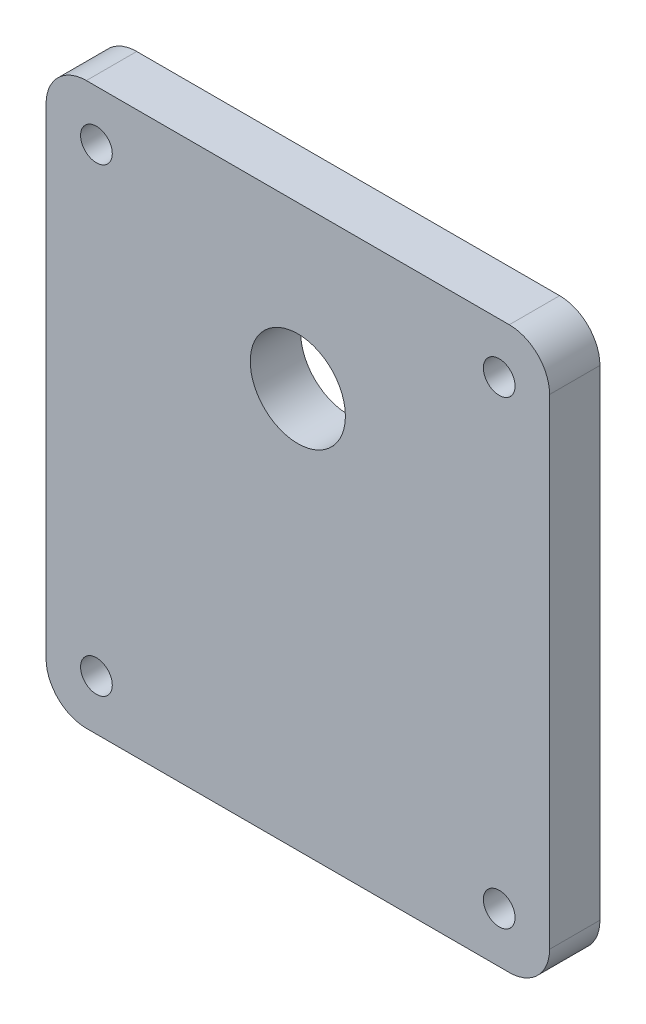
ISO-10303-21;
HEADER;
FILE_DESCRIPTION(('STEP AP214'),'2;1');
FILE_NAME('part.step','',(''),(''),'','','');
FILE_SCHEMA(('AUTOMOTIVE_DESIGN { 1 0 10303 214 1 1 1 1 }'));
ENDSEC;
DATA;
#1=APPLICATION_CONTEXT('core data for automotive mechanical design processes');
#2=APPLICATION_PROTOCOL_DEFINITION('international standard','automotive_design',2000,#1);
#3=PRODUCT_CONTEXT('',#1,'mechanical');
#4=PRODUCT('Part','Part','',(#3));
#5=PRODUCT_RELATED_PRODUCT_CATEGORY('part','',(#4));
#6=PRODUCT_DEFINITION_FORMATION('','',#4);
#7=PRODUCT_DEFINITION_CONTEXT('part definition',#1,'design');
#8=PRODUCT_DEFINITION('design','',#6,#7);
#9=PRODUCT_DEFINITION_SHAPE('','',#8);
#10=(LENGTH_UNIT() NAMED_UNIT(*) SI_UNIT(.MILLI.,.METRE.));
#11=(NAMED_UNIT(*) PLANE_ANGLE_UNIT() SI_UNIT($,.RADIAN.));
#12=(NAMED_UNIT(*) SI_UNIT($,.STERADIAN.) SOLID_ANGLE_UNIT());
#13=UNCERTAINTY_MEASURE_WITH_UNIT(LENGTH_MEASURE(1.E-05),#10,'distance_accuracy_value','');
#14=(GEOMETRIC_REPRESENTATION_CONTEXT(3) GLOBAL_UNCERTAINTY_ASSIGNED_CONTEXT((#13)) GLOBAL_UNIT_ASSIGNED_CONTEXT((#10,
#11,#12)) REPRESENTATION_CONTEXT('',''));
#15=CARTESIAN_POINT('',(0.,0.,0.));
#16=DIRECTION('',(0.,0.,1.));
#17=DIRECTION('',(1.,0.,0.));
#18=AXIS2_PLACEMENT_3D('',#15,#16,#17);
#19=CARTESIAN_POINT('',(-18.1,-22.0973062704397,-6.35));
#20=DIRECTION('',(0.,0.,-1.));
#21=DIRECTION('',(-1.,0.,0.));
#22=AXIS2_PLACEMENT_3D('',#19,#20,#21);
#23=PLANE('',#22);
#24=CARTESIAN_POINT('',(0.,17.8847845003735,-6.35));
#25=DIRECTION('',(0.,0.,1.));
#26=DIRECTION('',(1.,0.,0.));
#27=AXIS2_PLACEMENT_3D('',#24,#25,#26);
#28=CIRCLE('',#27,6.);
#29=CARTESIAN_POINT('',(6.,17.8847845003735,-6.35));
#30=VERTEX_POINT('',#29);
#31=EDGE_CURVE('E181',#30,#30,#28,.T.);
#32=ORIENTED_EDGE('',*,*,#31,.T.);
#33=EDGE_LOOP('',(#32));
#34=FACE_BOUND('',#33,.T.);
#35=CARTESIAN_POINT('',(-25.4,31.8547845003731,-6.35));
#36=DIRECTION('',(0.,0.,1.));
#37=DIRECTION('',(1.,0.,0.));
#38=AXIS2_PLACEMENT_3D('',#35,#36,#37);
#39=CIRCLE('',#38,2.00000000000001);
#40=CARTESIAN_POINT('',(-23.4,31.8547845003731,-6.35));
#41=VERTEX_POINT('',#40);
#42=EDGE_CURVE('E174',#41,#41,#39,.T.);
#43=ORIENTED_EDGE('',*,*,#42,.T.);
#44=EDGE_LOOP('',(#43));
#45=FACE_BOUND('',#44,.T.);
#46=CARTESIAN_POINT('',(-25.3999999999994,-26.1968739249436,-6.35));
#47=DIRECTION('',(0.,0.,1.));
#48=DIRECTION('',(1.,0.,0.));
#49=AXIS2_PLACEMENT_3D('',#46,#47,#48);
#50=CIRCLE('',#49,2.00000000000001);
#51=CARTESIAN_POINT('',(-23.3999999999994,-26.1968739249436,-6.35));
#52=VERTEX_POINT('',#51);
#53=EDGE_CURVE('E187',#52,#52,#50,.T.);
#54=ORIENTED_EDGE('',*,*,#53,.T.);
#55=EDGE_LOOP('',(#54));
#56=FACE_BOUND('',#55,.T.);
#57=CARTESIAN_POINT('',(25.4000000000006,-26.1968739249436,-6.35));
#58=DIRECTION('',(0.,0.,1.));
#59=DIRECTION('',(1.,0.,0.));
#60=AXIS2_PLACEMENT_3D('',#57,#58,#59);
#61=CIRCLE('',#60,2.00000000000001);
#62=CARTESIAN_POINT('',(27.4000000000006,-26.1968739249436,-6.35));
#63=VERTEX_POINT('',#62);
#64=EDGE_CURVE('E180',#63,#63,#61,.T.);
#65=ORIENTED_EDGE('',*,*,#64,.T.);
#66=EDGE_LOOP('',(#65));
#67=FACE_BOUND('',#66,.T.);
#68=CARTESIAN_POINT('',(25.4,31.8547845003735,-6.35));
#69=DIRECTION('',(0.,0.,1.));
#70=DIRECTION('',(1.,0.,0.));
#71=AXIS2_PLACEMENT_3D('',#68,#69,#70);
#72=CIRCLE('',#71,2.00000000000001);
#73=CARTESIAN_POINT('',(27.4,31.8547845003735,-6.35));
#74=VERTEX_POINT('',#73);
#75=EDGE_CURVE('E170',#74,#74,#72,.T.);
#76=ORIENTED_EDGE('',*,*,#75,.T.);
#77=EDGE_LOOP('',(#76));
#78=FACE_BOUND('',#77,.T.);
#79=DIRECTION('',(1.,0.,0.));
#80=VECTOR('',#79,1.);
#81=CARTESIAN_POINT('',(-18.1,-32.5468739249436,-6.35));
#82=LINE('',#81,#80);
#83=CARTESIAN_POINT('',(-26.67,-32.5468739249436,-6.35));
#84=VERTEX_POINT('',#83);
#85=CARTESIAN_POINT('',(26.67,-32.5468739249436,-6.35));
#86=VERTEX_POINT('',#85);
#87=EDGE_CURVE('E163',#84,#86,#82,.T.);
#88=ORIENTED_EDGE('',*,*,#87,.F.);
#89=CARTESIAN_POINT('',(-26.67,-27.4668739249436,-6.35));
#90=DIRECTION('',(0.,0.,-1.));
#91=DIRECTION('',(-1.,0.,0.));
#92=AXIS2_PLACEMENT_3D('',#89,#90,#91);
#93=CIRCLE('',#92,5.08);
#94=CARTESIAN_POINT('',(-31.75,-27.4668739249436,-6.35));
#95=VERTEX_POINT('',#94);
#96=EDGE_CURVE('E11',#84,#95,#93,.T.);
#97=ORIENTED_EDGE('',*,*,#96,.T.);
#98=DIRECTION('',(0.,1.,0.));
#99=VECTOR('',#98,1.);
#100=CARTESIAN_POINT('',(-31.75,38.2047845003735,-6.35));
#101=LINE('',#100,#99);
#102=CARTESIAN_POINT('',(-31.75,33.1247845003735,-6.35));
#103=VERTEX_POINT('',#102);
#104=EDGE_CURVE('E162',#95,#103,#101,.T.);
#105=ORIENTED_EDGE('',*,*,#104,.T.);
#106=CARTESIAN_POINT('',(-26.67,33.1247845003735,-6.35));
#107=DIRECTION('',(0.,0.,-1.));
#108=DIRECTION('',(-1.,0.,0.));
#109=AXIS2_PLACEMENT_3D('',#106,#107,#108);
#110=CIRCLE('',#109,5.08);
#111=CARTESIAN_POINT('',(-26.67,38.2047845003735,-6.35));
#112=VERTEX_POINT('',#111);
#113=EDGE_CURVE('E122',#103,#112,#110,.T.);
#114=ORIENTED_EDGE('',*,*,#113,.T.);
#115=DIRECTION('',(1.,0.,0.));
#116=VECTOR('',#115,1.);
#117=CARTESIAN_POINT('',(31.75,38.2047845003735,-6.35));
#118=LINE('',#117,#116);
#119=CARTESIAN_POINT('',(26.67,38.2047845003735,-6.35));
#120=VERTEX_POINT('',#119);
#121=EDGE_CURVE('E156',#112,#120,#118,.T.);
#122=ORIENTED_EDGE('',*,*,#121,.T.);
#123=CARTESIAN_POINT('',(26.67,33.1247845003735,-6.35));
#124=DIRECTION('',(0.,0.,-1.));
#125=DIRECTION('',(-1.,0.,0.));
#126=AXIS2_PLACEMENT_3D('',#123,#124,#125);
#127=CIRCLE('',#126,5.08);
#128=CARTESIAN_POINT('',(31.75,33.1247845003735,-6.35));
#129=VERTEX_POINT('',#128);
#130=EDGE_CURVE('E142',#120,#129,#127,.T.);
#131=ORIENTED_EDGE('',*,*,#130,.T.);
#132=DIRECTION('',(0.,-1.,0.));
#133=VECTOR('',#132,1.);
#134=CARTESIAN_POINT('',(31.75,38.2047845003735,-6.35));
#135=LINE('',#134,#133);
#136=CARTESIAN_POINT('',(31.75,-27.4668739249436,-6.35));
#137=VERTEX_POINT('',#136);
#138=EDGE_CURVE('E108',#129,#137,#135,.T.);
#139=ORIENTED_EDGE('',*,*,#138,.T.);
#140=CARTESIAN_POINT('',(26.67,-27.4668739249436,-6.35));
#141=DIRECTION('',(0.,0.,-1.));
#142=DIRECTION('',(-1.,0.,0.));
#143=AXIS2_PLACEMENT_3D('',#140,#141,#142);
#144=CIRCLE('',#143,5.08);
#145=EDGE_CURVE('E144',#137,#86,#144,.T.);
#146=ORIENTED_EDGE('',*,*,#145,.T.);
#147=EDGE_LOOP('',(#88,#97,#105,#114,#122,#131,#139,#146));
#148=FACE_BOUND('',#147,.T.);
#149=ADVANCED_FACE('F35',(#34,#45,#56,#67,#78,#148),#23,.T.);
#150=CARTESIAN_POINT('',(-18.1,-22.0973062704397,0.));
#151=DIRECTION('',(0.,0.,-1.));
#152=DIRECTION('',(-1.,0.,0.));
#153=AXIS2_PLACEMENT_3D('',#150,#151,#152);
#154=PLANE('',#153);
#155=CARTESIAN_POINT('',(0.,17.8847845003735,0.));
#156=DIRECTION('',(0.,0.,1.));
#157=DIRECTION('',(1.,0.,0.));
#158=AXIS2_PLACEMENT_3D('',#155,#156,#157);
#159=CIRCLE('',#158,6.);
#160=CARTESIAN_POINT('',(6.,17.8847845003735,0.));
#161=VERTEX_POINT('',#160);
#162=EDGE_CURVE('E195',#161,#161,#159,.T.);
#163=ORIENTED_EDGE('',*,*,#162,.F.);
#164=EDGE_LOOP('',(#163));
#165=FACE_BOUND('',#164,.T.);
#166=CARTESIAN_POINT('',(-25.4,31.8547845003731,0.));
#167=DIRECTION('',(0.,0.,1.));
#168=DIRECTION('',(1.,0.,0.));
#169=AXIS2_PLACEMENT_3D('',#166,#167,#168);
#170=CIRCLE('',#169,2.00000000000001);
#171=CARTESIAN_POINT('',(-23.4,31.8547845003731,0.));
#172=VERTEX_POINT('',#171);
#173=EDGE_CURVE('E190',#172,#172,#170,.T.);
#174=ORIENTED_EDGE('',*,*,#173,.F.);
#175=EDGE_LOOP('',(#174));
#176=FACE_BOUND('',#175,.T.);
#177=CARTESIAN_POINT('',(-25.3999999999994,-26.1968739249436,0.));
#178=DIRECTION('',(0.,0.,1.));
#179=DIRECTION('',(1.,0.,0.));
#180=AXIS2_PLACEMENT_3D('',#177,#178,#179);
#181=CIRCLE('',#180,2.00000000000001);
#182=CARTESIAN_POINT('',(-23.3999999999994,-26.1968739249436,0.));
#183=VERTEX_POINT('',#182);
#184=EDGE_CURVE('E184',#183,#183,#181,.T.);
#185=ORIENTED_EDGE('',*,*,#184,.F.);
#186=EDGE_LOOP('',(#185));
#187=FACE_BOUND('',#186,.T.);
#188=CARTESIAN_POINT('',(25.4000000000006,-26.1968739249436,0.));
#189=DIRECTION('',(0.,0.,1.));
#190=DIRECTION('',(1.,0.,0.));
#191=AXIS2_PLACEMENT_3D('',#188,#189,#190);
#192=CIRCLE('',#191,2.00000000000001);
#193=CARTESIAN_POINT('',(27.4000000000006,-26.1968739249436,0.));
#194=VERTEX_POINT('',#193);
#195=EDGE_CURVE('E177',#194,#194,#192,.T.);
#196=ORIENTED_EDGE('',*,*,#195,.F.);
#197=EDGE_LOOP('',(#196));
#198=FACE_BOUND('',#197,.T.);
#199=CARTESIAN_POINT('',(25.4,31.8547845003735,0.));
#200=DIRECTION('',(0.,0.,1.));
#201=DIRECTION('',(1.,0.,0.));
#202=AXIS2_PLACEMENT_3D('',#199,#200,#201);
#203=CIRCLE('',#202,2.00000000000001);
#204=CARTESIAN_POINT('',(27.4,31.8547845003735,0.));
#205=VERTEX_POINT('',#204);
#206=EDGE_CURVE('E171',#205,#205,#203,.T.);
#207=ORIENTED_EDGE('',*,*,#206,.F.);
#208=EDGE_LOOP('',(#207));
#209=FACE_BOUND('',#208,.T.);
#210=DIRECTION('',(0.,1.,0.));
#211=VECTOR('',#210,1.);
#212=CARTESIAN_POINT('',(-31.75,38.2047845003735,0.));
#213=LINE('',#212,#211);
#214=CARTESIAN_POINT('',(-31.75,-27.4668739249436,0.));
#215=VERTEX_POINT('',#214);
#216=CARTESIAN_POINT('',(-31.75,33.1247845003735,0.));
#217=VERTEX_POINT('',#216);
#218=EDGE_CURVE('E99',#215,#217,#213,.T.);
#219=ORIENTED_EDGE('',*,*,#218,.F.);
#220=CARTESIAN_POINT('',(-26.67,-27.4668739249436,0.));
#221=DIRECTION('',(0.,0.,-1.));
#222=DIRECTION('',(-1.,0.,0.));
#223=AXIS2_PLACEMENT_3D('',#220,#221,#222);
#224=CIRCLE('',#223,5.08);
#225=CARTESIAN_POINT('',(-26.67,-32.5468739249436,0.));
#226=VERTEX_POINT('',#225);
#227=EDGE_CURVE('E57',#215,#226,#224,.F.);
#228=ORIENTED_EDGE('',*,*,#227,.T.);
#229=DIRECTION('',(-1.,0.,0.));
#230=VECTOR('',#229,1.);
#231=CARTESIAN_POINT('',(-31.75,-32.5468739249436,0.));
#232=LINE('',#231,#230);
#233=CARTESIAN_POINT('',(26.67,-32.5468739249436,0.));
#234=VERTEX_POINT('',#233);
#235=EDGE_CURVE('E168',#234,#226,#232,.T.);
#236=ORIENTED_EDGE('',*,*,#235,.F.);
#237=CARTESIAN_POINT('',(26.67,-27.4668739249436,0.));
#238=DIRECTION('',(0.,0.,-1.));
#239=DIRECTION('',(-1.,0.,0.));
#240=AXIS2_PLACEMENT_3D('',#237,#238,#239);
#241=CIRCLE('',#240,5.08);
#242=CARTESIAN_POINT('',(31.75,-27.4668739249436,0.));
#243=VERTEX_POINT('',#242);
#244=EDGE_CURVE('E136',#234,#243,#241,.F.);
#245=ORIENTED_EDGE('',*,*,#244,.T.);
#246=DIRECTION('',(0.,-1.,0.));
#247=VECTOR('',#246,1.);
#248=CARTESIAN_POINT('',(31.75,38.2047845003735,0.));
#249=LINE('',#248,#247);
#250=CARTESIAN_POINT('',(31.75,33.1247845003735,0.));
#251=VERTEX_POINT('',#250);
#252=EDGE_CURVE('E123',#251,#243,#249,.T.);
#253=ORIENTED_EDGE('',*,*,#252,.F.);
#254=CARTESIAN_POINT('',(26.67,33.1247845003735,0.));
#255=DIRECTION('',(0.,0.,-1.));
#256=DIRECTION('',(-1.,0.,0.));
#257=AXIS2_PLACEMENT_3D('',#254,#255,#256);
#258=CIRCLE('',#257,5.08);
#259=CARTESIAN_POINT('',(26.67,38.2047845003735,0.));
#260=VERTEX_POINT('',#259);
#261=EDGE_CURVE('E134',#251,#260,#258,.F.);
#262=ORIENTED_EDGE('',*,*,#261,.T.);
#263=DIRECTION('',(1.,0.,0.));
#264=VECTOR('',#263,1.);
#265=CARTESIAN_POINT('',(31.75,38.2047845003735,0.));
#266=LINE('',#265,#264);
#267=CARTESIAN_POINT('',(-26.67,38.2047845003735,0.));
#268=VERTEX_POINT('',#267);
#269=EDGE_CURVE('E107',#268,#260,#266,.T.);
#270=ORIENTED_EDGE('',*,*,#269,.F.);
#271=CARTESIAN_POINT('',(-26.67,33.1247845003735,0.));
#272=DIRECTION('',(0.,0.,-1.));
#273=DIRECTION('',(-1.,0.,0.));
#274=AXIS2_PLACEMENT_3D('',#271,#272,#273);
#275=CIRCLE('',#274,5.08);
#276=EDGE_CURVE('E112',#268,#217,#275,.F.);
#277=ORIENTED_EDGE('',*,*,#276,.T.);
#278=EDGE_LOOP('',(#219,#228,#236,#245,#253,#262,#270,#277));
#279=FACE_BOUND('',#278,.T.);
#280=ADVANCED_FACE('F113',(#165,#176,#187,#198,#209,#279),#154,.F.);
#281=CARTESIAN_POINT('',(-31.75,38.2047845003735,0.));
#282=DIRECTION('',(-1.,0.,0.));
#283=DIRECTION('',(0.,-1.,0.));
#284=AXIS2_PLACEMENT_3D('',#281,#282,#283);
#285=PLANE('',#284);
#286=ORIENTED_EDGE('',*,*,#104,.F.);
#287=DIRECTION('',(0.,0.,1.));
#288=VECTOR('',#287,1.);
#289=CARTESIAN_POINT('',(-31.75,-27.4668739249436,0.));
#290=LINE('',#289,#288);
#291=EDGE_CURVE('E106',#95,#215,#290,.T.);
#292=ORIENTED_EDGE('',*,*,#291,.T.);
#293=ORIENTED_EDGE('',*,*,#218,.T.);
#294=DIRECTION('',(0.,0.,-1.));
#295=VECTOR('',#294,1.);
#296=CARTESIAN_POINT('',(-31.75,33.1247845003735,0.));
#297=LINE('',#296,#295);
#298=EDGE_CURVE('E104',#217,#103,#297,.T.);
#299=ORIENTED_EDGE('',*,*,#298,.T.);
#300=EDGE_LOOP('',(#286,#292,#293,#299));
#301=FACE_BOUND('',#300,.T.);
#302=ADVANCED_FACE('F102',(#301),#285,.T.);
#303=CARTESIAN_POINT('',(31.75,38.2047845003735,0.));
#304=DIRECTION('',(1.,0.,0.));
#305=DIRECTION('',(0.,1.,0.));
#306=AXIS2_PLACEMENT_3D('',#303,#304,#305);
#307=PLANE('',#306);
#308=ORIENTED_EDGE('',*,*,#252,.T.);
#309=DIRECTION('',(0.,0.,1.));
#310=VECTOR('',#309,1.);
#311=CARTESIAN_POINT('',(31.75,-27.4668739249436,-6.35));
#312=LINE('',#311,#310);
#313=EDGE_CURVE('E140',#243,#137,#312,.F.);
#314=ORIENTED_EDGE('',*,*,#313,.T.);
#315=ORIENTED_EDGE('',*,*,#138,.F.);
#316=DIRECTION('',(0.,0.,-1.));
#317=VECTOR('',#316,1.);
#318=CARTESIAN_POINT('',(31.75,33.1247845003735,0.));
#319=LINE('',#318,#317);
#320=EDGE_CURVE('E138',#129,#251,#319,.F.);
#321=ORIENTED_EDGE('',*,*,#320,.T.);
#322=EDGE_LOOP('',(#308,#314,#315,#321));
#323=FACE_BOUND('',#322,.T.);
#324=ADVANCED_FACE('F258',(#323),#307,.T.);
#325=CARTESIAN_POINT('',(31.75,38.2047845003735,0.));
#326=DIRECTION('',(0.,1.,0.));
#327=DIRECTION('',(0.,0.,1.));
#328=AXIS2_PLACEMENT_3D('',#325,#326,#327);
#329=PLANE('',#328);
#330=ORIENTED_EDGE('',*,*,#269,.T.);
#331=DIRECTION('',(0.,0.,-1.));
#332=VECTOR('',#331,1.);
#333=CARTESIAN_POINT('',(26.67,38.2047845003735,0.));
#334=LINE('',#333,#332);
#335=EDGE_CURVE('E147',#260,#120,#334,.T.);
#336=ORIENTED_EDGE('',*,*,#335,.T.);
#337=ORIENTED_EDGE('',*,*,#121,.F.);
#338=DIRECTION('',(0.,0.,-1.));
#339=VECTOR('',#338,1.);
#340=CARTESIAN_POINT('',(-26.67,38.2047845003735,0.));
#341=LINE('',#340,#339);
#342=EDGE_CURVE('E118',#112,#268,#341,.F.);
#343=ORIENTED_EDGE('',*,*,#342,.T.);
#344=EDGE_LOOP('',(#330,#336,#337,#343));
#345=FACE_BOUND('',#344,.T.);
#346=ADVANCED_FACE('F155',(#345),#329,.T.);
#347=CARTESIAN_POINT('',(-31.75,-32.5468739249436,-10.));
#348=DIRECTION('',(0.,1.,0.));
#349=DIRECTION('',(0.,0.,1.));
#350=AXIS2_PLACEMENT_3D('',#347,#348,#349);
#351=PLANE('',#350);
#352=ORIENTED_EDGE('',*,*,#235,.T.);
#353=DIRECTION('',(0.,0.,1.));
#354=VECTOR('',#353,1.);
#355=CARTESIAN_POINT('',(-26.67,-32.5468739249436,-6.35));
#356=LINE('',#355,#354);
#357=EDGE_CURVE('E43',#226,#84,#356,.F.);
#358=ORIENTED_EDGE('',*,*,#357,.T.);
#359=ORIENTED_EDGE('',*,*,#87,.T.);
#360=DIRECTION('',(0.,0.,1.));
#361=VECTOR('',#360,1.);
#362=CARTESIAN_POINT('',(26.67,-32.5468739249436,0.));
#363=LINE('',#362,#361);
#364=EDGE_CURVE('E117',#86,#234,#363,.T.);
#365=ORIENTED_EDGE('',*,*,#364,.T.);
#366=EDGE_LOOP('',(#352,#358,#359,#365));
#367=FACE_BOUND('',#366,.T.);
#368=ADVANCED_FACE('F224',(#367),#351,.F.);
#369=CARTESIAN_POINT('',(25.4,31.8547845003735,-6.35));
#370=DIRECTION('',(0.,0.,1.));
#371=DIRECTION('',(1.,0.,0.));
#372=AXIS2_PLACEMENT_3D('',#369,#370,#371);
#373=CYLINDRICAL_SURFACE('',#372,2.00000000000001);
#374=ORIENTED_EDGE('',*,*,#75,.F.);
#375=EDGE_LOOP('',(#374));
#376=FACE_BOUND('',#375,.T.);
#377=ORIENTED_EDGE('',*,*,#206,.T.);
#378=EDGE_LOOP('',(#377));
#379=FACE_BOUND('',#378,.T.);
#380=ADVANCED_FACE('F221',(#376,#379),#373,.F.);
#381=CARTESIAN_POINT('',(25.4000000000006,-26.1968739249436,-6.35));
#382=DIRECTION('',(0.,0.,1.));
#383=DIRECTION('',(1.,0.,0.));
#384=AXIS2_PLACEMENT_3D('',#381,#382,#383);
#385=CYLINDRICAL_SURFACE('',#384,2.00000000000001);
#386=ORIENTED_EDGE('',*,*,#64,.F.);
#387=EDGE_LOOP('',(#386));
#388=FACE_BOUND('',#387,.T.);
#389=ORIENTED_EDGE('',*,*,#195,.T.);
#390=EDGE_LOOP('',(#389));
#391=FACE_BOUND('',#390,.T.);
#392=ADVANCED_FACE('F223',(#388,#391),#385,.F.);
#393=CARTESIAN_POINT('',(-25.3999999999994,-26.1968739249436,-6.35));
#394=DIRECTION('',(0.,0.,1.));
#395=DIRECTION('',(1.,0.,0.));
#396=AXIS2_PLACEMENT_3D('',#393,#394,#395);
#397=CYLINDRICAL_SURFACE('',#396,2.00000000000001);
#398=ORIENTED_EDGE('',*,*,#53,.F.);
#399=EDGE_LOOP('',(#398));
#400=FACE_BOUND('',#399,.T.);
#401=ORIENTED_EDGE('',*,*,#184,.T.);
#402=EDGE_LOOP('',(#401));
#403=FACE_BOUND('',#402,.T.);
#404=ADVANCED_FACE('F231',(#400,#403),#397,.F.);
#405=CARTESIAN_POINT('',(-25.4,31.8547845003731,-6.35));
#406=DIRECTION('',(0.,0.,1.));
#407=DIRECTION('',(1.,0.,0.));
#408=AXIS2_PLACEMENT_3D('',#405,#406,#407);
#409=CYLINDRICAL_SURFACE('',#408,2.00000000000001);
#410=ORIENTED_EDGE('',*,*,#42,.F.);
#411=EDGE_LOOP('',(#410));
#412=FACE_BOUND('',#411,.T.);
#413=ORIENTED_EDGE('',*,*,#173,.T.);
#414=EDGE_LOOP('',(#413));
#415=FACE_BOUND('',#414,.T.);
#416=ADVANCED_FACE('F206',(#412,#415),#409,.F.);
#417=CARTESIAN_POINT('',(0.,17.8847845003735,-6.35));
#418=DIRECTION('',(0.,0.,1.));
#419=DIRECTION('',(1.,0.,0.));
#420=AXIS2_PLACEMENT_3D('',#417,#418,#419);
#421=CYLINDRICAL_SURFACE('',#420,6.);
#422=ORIENTED_EDGE('',*,*,#31,.F.);
#423=EDGE_LOOP('',(#422));
#424=FACE_BOUND('',#423,.T.);
#425=ORIENTED_EDGE('',*,*,#162,.T.);
#426=EDGE_LOOP('',(#425));
#427=FACE_BOUND('',#426,.T.);
#428=ADVANCED_FACE('F203',(#424,#427),#421,.F.);
#429=CARTESIAN_POINT('',(-26.67,33.1247845003735,0.));
#430=DIRECTION('',(0.,0.,-1.));
#431=DIRECTION('',(-1.,0.,0.));
#432=AXIS2_PLACEMENT_3D('',#429,#430,#431);
#433=CYLINDRICAL_SURFACE('',#432,5.08);
#434=ORIENTED_EDGE('',*,*,#276,.F.);
#435=ORIENTED_EDGE('',*,*,#342,.F.);
#436=ORIENTED_EDGE('',*,*,#113,.F.);
#437=ORIENTED_EDGE('',*,*,#298,.F.);
#438=EDGE_LOOP('',(#434,#435,#436,#437));
#439=FACE_BOUND('',#438,.T.);
#440=ADVANCED_FACE('F121',(#439),#433,.T.);
#441=CARTESIAN_POINT('',(26.67,-27.4668739249436,-10.));
#442=DIRECTION('',(0.,0.,-1.));
#443=DIRECTION('',(-1.,0.,0.));
#444=AXIS2_PLACEMENT_3D('',#441,#442,#443);
#445=CYLINDRICAL_SURFACE('',#444,5.08);
#446=ORIENTED_EDGE('',*,*,#145,.F.);
#447=ORIENTED_EDGE('',*,*,#313,.F.);
#448=ORIENTED_EDGE('',*,*,#244,.F.);
#449=ORIENTED_EDGE('',*,*,#364,.F.);
#450=EDGE_LOOP('',(#446,#447,#448,#449));
#451=FACE_BOUND('',#450,.T.);
#452=ADVANCED_FACE('F245',(#451),#445,.T.);
#453=CARTESIAN_POINT('',(26.67,33.1247845003735,0.));
#454=DIRECTION('',(0.,0.,-1.));
#455=DIRECTION('',(-1.,0.,0.));
#456=AXIS2_PLACEMENT_3D('',#453,#454,#455);
#457=CYLINDRICAL_SURFACE('',#456,5.08);
#458=ORIENTED_EDGE('',*,*,#261,.F.);
#459=ORIENTED_EDGE('',*,*,#320,.F.);
#460=ORIENTED_EDGE('',*,*,#130,.F.);
#461=ORIENTED_EDGE('',*,*,#335,.F.);
#462=EDGE_LOOP('',(#458,#459,#460,#461));
#463=FACE_BOUND('',#462,.T.);
#464=ADVANCED_FACE('F247',(#463),#457,.T.);
#465=CARTESIAN_POINT('',(-26.67,-27.4668739249436,0.));
#466=DIRECTION('',(0.,0.,-1.));
#467=DIRECTION('',(-1.,0.,0.));
#468=AXIS2_PLACEMENT_3D('',#465,#466,#467);
#469=CYLINDRICAL_SURFACE('',#468,5.08);
#470=ORIENTED_EDGE('',*,*,#96,.F.);
#471=ORIENTED_EDGE('',*,*,#357,.F.);
#472=ORIENTED_EDGE('',*,*,#227,.F.);
#473=ORIENTED_EDGE('',*,*,#291,.F.);
#474=EDGE_LOOP('',(#470,#471,#472,#473));
#475=FACE_BOUND('',#474,.T.);
#476=ADVANCED_FACE('F37',(#475),#469,.T.);
#477=CLOSED_SHELL('',(#149,#280,#302,#324,#346,#368,#380,#392,#404,#416,#428,#440,#452,#464,#476));
#478=MANIFOLD_SOLID_BREP('B2',#477);
#479=ADVANCED_BREP_SHAPE_REPRESENTATION('',(#18,#478),#14);
#480=SHAPE_DEFINITION_REPRESENTATION(#9,#479);
ENDSEC;
END-ISO-10303-21;
